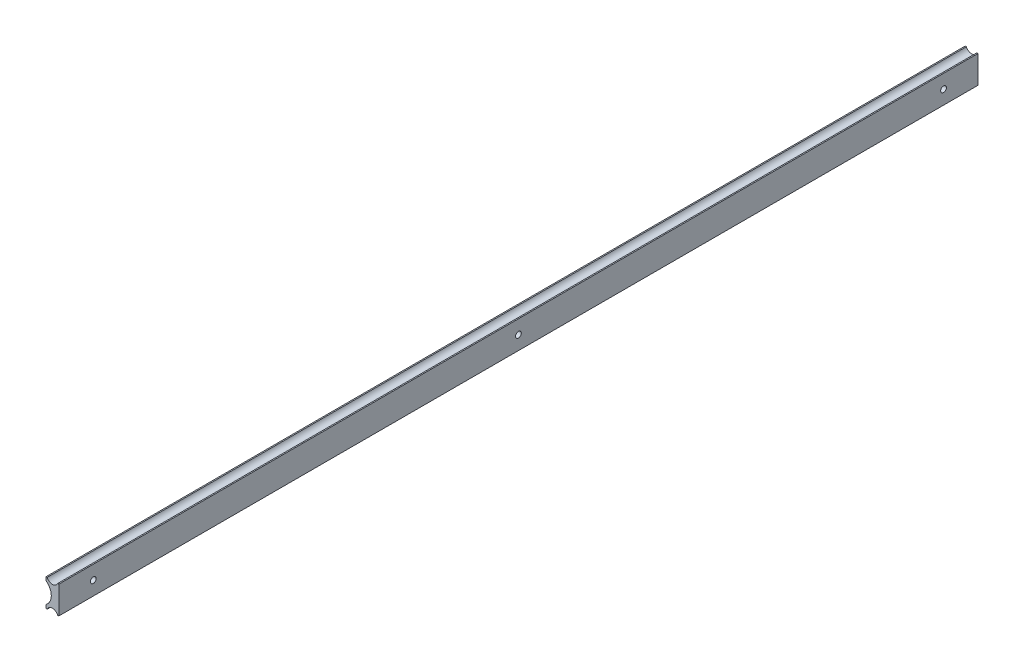
ISO-10303-21;
HEADER;
FILE_DESCRIPTION(('STEP AP214'),'2;1');
FILE_NAME('part.step','',(''),(''),'','','');
FILE_SCHEMA(('AUTOMOTIVE_DESIGN { 1 0 10303 214 1 1 1 1 }'));
ENDSEC;
DATA;
#1=APPLICATION_CONTEXT('core data for automotive mechanical design processes');
#2=APPLICATION_PROTOCOL_DEFINITION('international standard','automotive_design',2000,#1);
#3=PRODUCT_CONTEXT('',#1,'mechanical');
#4=PRODUCT('Part','Part','',(#3));
#5=PRODUCT_RELATED_PRODUCT_CATEGORY('part','',(#4));
#6=PRODUCT_DEFINITION_FORMATION('','',#4);
#7=PRODUCT_DEFINITION_CONTEXT('part definition',#1,'design');
#8=PRODUCT_DEFINITION('design','',#6,#7);
#9=PRODUCT_DEFINITION_SHAPE('','',#8);
#10=(LENGTH_UNIT() NAMED_UNIT(*) SI_UNIT(.MILLI.,.METRE.));
#11=(NAMED_UNIT(*) PLANE_ANGLE_UNIT() SI_UNIT($,.RADIAN.));
#12=(NAMED_UNIT(*) SI_UNIT($,.STERADIAN.) SOLID_ANGLE_UNIT());
#13=UNCERTAINTY_MEASURE_WITH_UNIT(LENGTH_MEASURE(1.E-05),#10,'distance_accuracy_value','');
#14=(GEOMETRIC_REPRESENTATION_CONTEXT(3) GLOBAL_UNCERTAINTY_ASSIGNED_CONTEXT((#13)) GLOBAL_UNIT_ASSIGNED_CONTEXT((#10,
#11,#12)) REPRESENTATION_CONTEXT('',''));
#15=CARTESIAN_POINT('',(0.,0.,0.));
#16=DIRECTION('',(0.,0.,1.));
#17=DIRECTION('',(1.,0.,0.));
#18=AXIS2_PLACEMENT_3D('',#15,#16,#17);
#19=CARTESIAN_POINT('',(-2.8,-6.,200.));
#20=DIRECTION('',(1.,0.,0.));
#21=DIRECTION('',(0.,1.,0.));
#22=AXIS2_PLACEMENT_3D('',#19,#20,#21);
#23=PLANE('',#22);
#24=DIRECTION('',(0.,-1.,0.));
#25=VECTOR('',#24,1.);
#26=CARTESIAN_POINT('',(-2.8,-6.,-200.));
#27=LINE('',#26,#25);
#28=CARTESIAN_POINT('',(-2.8,6.,-200.));
#29=VERTEX_POINT('',#28);
#30=CARTESIAN_POINT('',(-2.8,4.47325384926901,-200.));
#31=VERTEX_POINT('',#30);
#32=EDGE_CURVE('E140',#29,#31,#27,.T.);
#33=ORIENTED_EDGE('',*,*,#32,.T.);
#34=DIRECTION('',(0.,0.,1.));
#35=VECTOR('',#34,1.);
#36=CARTESIAN_POINT('',(-2.8,4.47325384926901,-490.));
#37=LINE('',#36,#35);
#38=CARTESIAN_POINT('',(-2.8,4.47325384926901,200.));
#39=VERTEX_POINT('',#38);
#40=EDGE_CURVE('E60',#31,#39,#37,.T.);
#41=ORIENTED_EDGE('',*,*,#40,.T.);
#42=DIRECTION('',(0.,-1.,0.));
#43=VECTOR('',#42,1.);
#44=CARTESIAN_POINT('',(-2.8,-6.,200.));
#45=LINE('',#44,#43);
#46=CARTESIAN_POINT('',(-2.8,6.,200.));
#47=VERTEX_POINT('',#46);
#48=EDGE_CURVE('E256',#47,#39,#45,.T.);
#49=ORIENTED_EDGE('',*,*,#48,.F.);
#50=DIRECTION('',(0.,0.,-1.));
#51=VECTOR('',#50,1.);
#52=CARTESIAN_POINT('',(-2.8,6.,200.));
#53=LINE('',#52,#51);
#54=EDGE_CURVE('E157',#47,#29,#53,.T.);
#55=ORIENTED_EDGE('',*,*,#54,.T.);
#56=EDGE_LOOP('',(#33,#41,#49,#55));
#57=FACE_BOUND('',#56,.T.);
#58=ADVANCED_FACE('F39',(#57),#23,.F.);
#59=CARTESIAN_POINT('',(-2.8,-6.,200.));
#60=DIRECTION('',(0.,1.,0.));
#61=DIRECTION('',(-1.,0.,0.));
#62=AXIS2_PLACEMENT_3D('',#59,#60,#61);
#63=PLANE('',#62);
#64=DIRECTION('',(0.,0.,1.));
#65=VECTOR('',#64,1.);
#66=CARTESIAN_POINT('',(-2.29128784747792,-6.,-230.));
#67=LINE('',#66,#65);
#68=CARTESIAN_POINT('',(-2.29128784747792,-6.,200.));
#69=VERTEX_POINT('',#68);
#70=CARTESIAN_POINT('',(-2.29128784747792,-6.,-200.));
#71=VERTEX_POINT('',#70);
#72=EDGE_CURVE('E68',#69,#71,#67,.F.);
#73=ORIENTED_EDGE('',*,*,#72,.F.);
#74=DIRECTION('',(1.,0.,0.));
#75=VECTOR('',#74,1.);
#76=CARTESIAN_POINT('',(-2.8,-6.,200.));
#77=LINE('',#76,#75);
#78=CARTESIAN_POINT('',(-2.8,-6.,200.));
#79=VERTEX_POINT('',#78);
#80=EDGE_CURVE('E155',#79,#69,#77,.T.);
#81=ORIENTED_EDGE('',*,*,#80,.F.);
#82=DIRECTION('',(0.,0.,-1.));
#83=VECTOR('',#82,1.);
#84=CARTESIAN_POINT('',(-2.8,-6.,200.));
#85=LINE('',#84,#83);
#86=CARTESIAN_POINT('',(-2.8,-6.,-200.));
#87=VERTEX_POINT('',#86);
#88=EDGE_CURVE('E154',#79,#87,#85,.T.);
#89=ORIENTED_EDGE('',*,*,#88,.T.);
#90=DIRECTION('',(1.,0.,0.));
#91=VECTOR('',#90,1.);
#92=CARTESIAN_POINT('',(-2.8,-6.,-200.));
#93=LINE('',#92,#91);
#94=EDGE_CURVE('E139',#87,#71,#93,.T.);
#95=ORIENTED_EDGE('',*,*,#94,.T.);
#96=EDGE_LOOP('',(#73,#81,#89,#95));
#97=FACE_BOUND('',#96,.T.);
#98=ADVANCED_FACE('F196',(#97),#63,.F.);
#99=DIRECTION('',(0.,0.,1.));
#100=VECTOR('',#99,1.);
#101=CARTESIAN_POINT('',(2.29128784747792,-6.,-230.));
#102=LINE('',#101,#100);
#103=CARTESIAN_POINT('',(2.29128784747792,-6.,-200.));
#104=VERTEX_POINT('',#103);
#105=CARTESIAN_POINT('',(2.29128784747792,-6.,200.));
#106=VERTEX_POINT('',#105);
#107=EDGE_CURVE('E266',#104,#106,#102,.T.);
#108=ORIENTED_EDGE('',*,*,#107,.F.);
#109=CARTESIAN_POINT('',(2.8,-6.,-200.));
#110=VERTEX_POINT('',#109);
#111=EDGE_CURVE('E143',#104,#110,#93,.T.);
#112=ORIENTED_EDGE('',*,*,#111,.T.);
#113=DIRECTION('',(0.,0.,-1.));
#114=VECTOR('',#113,1.);
#115=CARTESIAN_POINT('',(2.8,-6.,200.));
#116=LINE('',#115,#114);
#117=CARTESIAN_POINT('',(2.8,-6.,200.));
#118=VERTEX_POINT('',#117);
#119=EDGE_CURVE('E151',#118,#110,#116,.T.);
#120=ORIENTED_EDGE('',*,*,#119,.F.);
#121=EDGE_CURVE('E259',#106,#118,#77,.T.);
#122=ORIENTED_EDGE('',*,*,#121,.F.);
#123=EDGE_LOOP('',(#108,#112,#120,#122));
#124=FACE_BOUND('',#123,.T.);
#125=ADVANCED_FACE('F202',(#124),#63,.F.);
#126=CARTESIAN_POINT('',(-2.8,6.,200.));
#127=DIRECTION('',(0.,-1.,0.));
#128=DIRECTION('',(1.,0.,0.));
#129=AXIS2_PLACEMENT_3D('',#126,#127,#128);
#130=PLANE('',#129);
#131=DIRECTION('',(-1.,0.,0.));
#132=VECTOR('',#131,1.);
#133=CARTESIAN_POINT('',(-2.8,6.,-200.));
#134=LINE('',#133,#132);
#135=CARTESIAN_POINT('',(2.8,6.,-200.));
#136=VERTEX_POINT('',#135);
#137=CARTESIAN_POINT('',(2.29128784747792,6.,-200.));
#138=VERTEX_POINT('',#137);
#139=EDGE_CURVE('E141',#136,#138,#134,.T.);
#140=ORIENTED_EDGE('',*,*,#139,.T.);
#141=DIRECTION('',(0.,0.,1.));
#142=VECTOR('',#141,1.);
#143=CARTESIAN_POINT('',(2.29128784747792,6.,-230.));
#144=LINE('',#143,#142);
#145=CARTESIAN_POINT('',(2.29128784747792,6.,200.));
#146=VERTEX_POINT('',#145);
#147=EDGE_CURVE('E228',#138,#146,#144,.T.);
#148=ORIENTED_EDGE('',*,*,#147,.T.);
#149=DIRECTION('',(-1.,0.,0.));
#150=VECTOR('',#149,1.);
#151=CARTESIAN_POINT('',(-2.8,6.,200.));
#152=LINE('',#151,#150);
#153=CARTESIAN_POINT('',(2.8,6.,200.));
#154=VERTEX_POINT('',#153);
#155=EDGE_CURVE('E254',#154,#146,#152,.T.);
#156=ORIENTED_EDGE('',*,*,#155,.F.);
#157=DIRECTION('',(0.,0.,-1.));
#158=VECTOR('',#157,1.);
#159=CARTESIAN_POINT('',(2.8,6.,200.));
#160=LINE('',#159,#158);
#161=EDGE_CURVE('E160',#154,#136,#160,.T.);
#162=ORIENTED_EDGE('',*,*,#161,.T.);
#163=EDGE_LOOP('',(#140,#148,#156,#162));
#164=FACE_BOUND('',#163,.T.);
#165=ADVANCED_FACE('F215',(#164),#130,.F.);
#166=CARTESIAN_POINT('',(2.8,-6.,200.));
#167=DIRECTION('',(-1.,0.,0.));
#168=DIRECTION('',(0.,0.,1.));
#169=AXIS2_PLACEMENT_3D('',#166,#167,#168);
#170=PLANE('',#169);
#171=CARTESIAN_POINT('',(2.8,0.,185.));
#172=DIRECTION('',(1.,0.,0.));
#173=DIRECTION('',(0.,0.,-1.));
#174=AXIS2_PLACEMENT_3D('',#171,#172,#173);
#175=CIRCLE('',#174,1.25);
#176=CARTESIAN_POINT('',(2.8,0.,183.75));
#177=VERTEX_POINT('',#176);
#178=EDGE_CURVE('E280',#177,#177,#175,.T.);
#179=ORIENTED_EDGE('',*,*,#178,.F.);
#180=EDGE_LOOP('',(#179));
#181=FACE_BOUND('',#180,.T.);
#182=CARTESIAN_POINT('',(2.8,0.,0.));
#183=DIRECTION('',(1.,0.,0.));
#184=DIRECTION('',(0.,0.,-1.));
#185=AXIS2_PLACEMENT_3D('',#182,#183,#184);
#186=CIRCLE('',#185,1.25);
#187=CARTESIAN_POINT('',(2.8,0.,-1.25));
#188=VERTEX_POINT('',#187);
#189=EDGE_CURVE('E277',#188,#188,#186,.T.);
#190=ORIENTED_EDGE('',*,*,#189,.F.);
#191=EDGE_LOOP('',(#190));
#192=FACE_BOUND('',#191,.T.);
#193=CARTESIAN_POINT('',(2.8,0.,-185.));
#194=DIRECTION('',(1.,0.,0.));
#195=DIRECTION('',(0.,0.,-1.));
#196=AXIS2_PLACEMENT_3D('',#193,#194,#195);
#197=CIRCLE('',#196,1.25);
#198=CARTESIAN_POINT('',(2.8,0.,-186.25));
#199=VERTEX_POINT('',#198);
#200=EDGE_CURVE('E171',#199,#199,#197,.T.);
#201=ORIENTED_EDGE('',*,*,#200,.F.);
#202=EDGE_LOOP('',(#201));
#203=FACE_BOUND('',#202,.T.);
#204=DIRECTION('',(0.,1.,0.));
#205=VECTOR('',#204,1.);
#206=CARTESIAN_POINT('',(2.8,-6.,-200.));
#207=LINE('',#206,#205);
#208=EDGE_CURVE('E235',#110,#136,#207,.T.);
#209=ORIENTED_EDGE('',*,*,#208,.T.);
#210=ORIENTED_EDGE('',*,*,#161,.F.);
#211=DIRECTION('',(0.,1.,0.));
#212=VECTOR('',#211,1.);
#213=CARTESIAN_POINT('',(2.8,-6.,200.));
#214=LINE('',#213,#212);
#215=EDGE_CURVE('E150',#118,#154,#214,.T.);
#216=ORIENTED_EDGE('',*,*,#215,.F.);
#217=ORIENTED_EDGE('',*,*,#119,.T.);
#218=EDGE_LOOP('',(#209,#210,#216,#217));
#219=FACE_BOUND('',#218,.T.);
#220=ADVANCED_FACE('F41',(#181,#192,#203,#219),#170,.F.);
#221=CARTESIAN_POINT('',(-2.29128784747792,6.,200.));
#222=VERTEX_POINT('',#221);
#223=EDGE_CURVE('E243',#222,#47,#152,.T.);
#224=ORIENTED_EDGE('',*,*,#223,.F.);
#225=DIRECTION('',(0.,0.,1.));
#226=VECTOR('',#225,1.);
#227=CARTESIAN_POINT('',(-2.29128784747792,6.,-230.));
#228=LINE('',#227,#226);
#229=CARTESIAN_POINT('',(-2.29128784747792,6.,-200.));
#230=VERTEX_POINT('',#229);
#231=EDGE_CURVE('E240',#222,#230,#228,.F.);
#232=ORIENTED_EDGE('',*,*,#231,.T.);
#233=EDGE_CURVE('E145',#230,#29,#134,.T.);
#234=ORIENTED_EDGE('',*,*,#233,.T.);
#235=ORIENTED_EDGE('',*,*,#54,.F.);
#236=EDGE_LOOP('',(#224,#232,#234,#235));
#237=FACE_BOUND('',#236,.T.);
#238=ADVANCED_FACE('F207',(#237),#130,.F.);
#239=CARTESIAN_POINT('',(-2.8,-4.47325384926901,200.));
#240=VERTEX_POINT('',#239);
#241=EDGE_CURVE('E133',#240,#79,#45,.T.);
#242=ORIENTED_EDGE('',*,*,#241,.F.);
#243=DIRECTION('',(0.,0.,1.));
#244=VECTOR('',#243,1.);
#245=CARTESIAN_POINT('',(-2.8,-4.47325384926901,-490.));
#246=LINE('',#245,#244);
#247=CARTESIAN_POINT('',(-2.8,-4.47325384926901,-200.));
#248=VERTEX_POINT('',#247);
#249=EDGE_CURVE('E121',#240,#248,#246,.F.);
#250=ORIENTED_EDGE('',*,*,#249,.T.);
#251=EDGE_CURVE('E131',#248,#87,#27,.T.);
#252=ORIENTED_EDGE('',*,*,#251,.T.);
#253=ORIENTED_EDGE('',*,*,#88,.F.);
#254=EDGE_LOOP('',(#242,#250,#252,#253));
#255=FACE_BOUND('',#254,.T.);
#256=ADVANCED_FACE('F129',(#255),#23,.F.);
#257=CARTESIAN_POINT('',(0.,0.,200.));
#258=DIRECTION('',(0.,0.,-1.));
#259=DIRECTION('',(-1.,0.,0.));
#260=AXIS2_PLACEMENT_3D('',#257,#258,#259);
#261=PLANE('',#260);
#262=ORIENTED_EDGE('',*,*,#48,.T.);
#263=CARTESIAN_POINT('',(-6.,0.,200.));
#264=DIRECTION('',(0.,0.,-1.));
#265=DIRECTION('',(-1.,0.,0.));
#266=AXIS2_PLACEMENT_3D('',#263,#264,#265);
#267=CIRCLE('',#266,5.5);
#268=EDGE_CURVE('E269',#39,#240,#267,.T.);
#269=ORIENTED_EDGE('',*,*,#268,.T.);
#270=ORIENTED_EDGE('',*,*,#241,.T.);
#271=ORIENTED_EDGE('',*,*,#80,.T.);
#272=CARTESIAN_POINT('',(0.,-7.,200.));
#273=DIRECTION('',(0.,0.,-1.));
#274=DIRECTION('',(-1.,0.,0.));
#275=AXIS2_PLACEMENT_3D('',#272,#273,#274);
#276=CIRCLE('',#275,2.5);
#277=EDGE_CURVE('E244',#106,#69,#276,.F.);
#278=ORIENTED_EDGE('',*,*,#277,.F.);
#279=ORIENTED_EDGE('',*,*,#121,.T.);
#280=ORIENTED_EDGE('',*,*,#215,.T.);
#281=ORIENTED_EDGE('',*,*,#155,.T.);
#282=CARTESIAN_POINT('',(0.,7.,200.));
#283=DIRECTION('',(0.,0.,-1.));
#284=DIRECTION('',(-1.,0.,0.));
#285=AXIS2_PLACEMENT_3D('',#282,#283,#284);
#286=CIRCLE('',#285,2.5);
#287=EDGE_CURVE('E246',#146,#222,#286,.T.);
#288=ORIENTED_EDGE('',*,*,#287,.T.);
#289=ORIENTED_EDGE('',*,*,#223,.T.);
#290=EDGE_LOOP('',(#262,#269,#270,#271,#278,#279,#280,#281,#288,#289));
#291=FACE_BOUND('',#290,.T.);
#292=ADVANCED_FACE('F206',(#291),#261,.F.);
#293=CARTESIAN_POINT('',(0.,0.,-200.));
#294=DIRECTION('',(0.,0.,-1.));
#295=DIRECTION('',(-1.,0.,0.));
#296=AXIS2_PLACEMENT_3D('',#293,#294,#295);
#297=PLANE('',#296);
#298=CARTESIAN_POINT('',(-6.,0.,-200.));
#299=DIRECTION('',(0.,0.,-1.));
#300=DIRECTION('',(-1.,0.,0.));
#301=AXIS2_PLACEMENT_3D('',#298,#299,#300);
#302=CIRCLE('',#301,5.5);
#303=EDGE_CURVE('E11',#31,#248,#302,.T.);
#304=ORIENTED_EDGE('',*,*,#303,.F.);
#305=ORIENTED_EDGE('',*,*,#32,.F.);
#306=ORIENTED_EDGE('',*,*,#233,.F.);
#307=CARTESIAN_POINT('',(0.,7.,-200.));
#308=DIRECTION('',(0.,0.,-1.));
#309=DIRECTION('',(-1.,0.,0.));
#310=AXIS2_PLACEMENT_3D('',#307,#308,#309);
#311=CIRCLE('',#310,2.5);
#312=EDGE_CURVE('E163',#138,#230,#311,.T.);
#313=ORIENTED_EDGE('',*,*,#312,.F.);
#314=ORIENTED_EDGE('',*,*,#139,.F.);
#315=ORIENTED_EDGE('',*,*,#208,.F.);
#316=ORIENTED_EDGE('',*,*,#111,.F.);
#317=CARTESIAN_POINT('',(0.,-7.,-200.));
#318=DIRECTION('',(0.,0.,-1.));
#319=DIRECTION('',(-1.,0.,0.));
#320=AXIS2_PLACEMENT_3D('',#317,#318,#319);
#321=CIRCLE('',#320,2.5);
#322=EDGE_CURVE('E53',#104,#71,#321,.F.);
#323=ORIENTED_EDGE('',*,*,#322,.T.);
#324=ORIENTED_EDGE('',*,*,#94,.F.);
#325=ORIENTED_EDGE('',*,*,#251,.F.);
#326=EDGE_LOOP('',(#304,#305,#306,#313,#314,#315,#316,#323,#324,#325));
#327=FACE_BOUND('',#326,.T.);
#328=ADVANCED_FACE('F137',(#327),#297,.T.);
#329=CARTESIAN_POINT('',(0.,7.,-230.));
#330=DIRECTION('',(0.,0.,1.));
#331=DIRECTION('',(1.,0.,0.));
#332=AXIS2_PLACEMENT_3D('',#329,#330,#331);
#333=CYLINDRICAL_SURFACE('',#332,2.5);
#334=ORIENTED_EDGE('',*,*,#147,.F.);
#335=ORIENTED_EDGE('',*,*,#312,.T.);
#336=ORIENTED_EDGE('',*,*,#231,.F.);
#337=ORIENTED_EDGE('',*,*,#287,.F.);
#338=EDGE_LOOP('',(#334,#335,#336,#337));
#339=FACE_BOUND('',#338,.T.);
#340=ADVANCED_FACE('F239',(#339),#333,.F.);
#341=CARTESIAN_POINT('',(0.,-7.,-230.));
#342=DIRECTION('',(0.,0.,1.));
#343=DIRECTION('',(1.,0.,0.));
#344=AXIS2_PLACEMENT_3D('',#341,#342,#343);
#345=CYLINDRICAL_SURFACE('',#344,2.5);
#346=ORIENTED_EDGE('',*,*,#277,.T.);
#347=ORIENTED_EDGE('',*,*,#72,.T.);
#348=ORIENTED_EDGE('',*,*,#322,.F.);
#349=ORIENTED_EDGE('',*,*,#107,.T.);
#350=EDGE_LOOP('',(#346,#347,#348,#349));
#351=FACE_BOUND('',#350,.T.);
#352=ADVANCED_FACE('F287',(#351),#345,.F.);
#353=CARTESIAN_POINT('',(-6.,0.,-490.));
#354=DIRECTION('',(0.,0.,1.));
#355=DIRECTION('',(1.,0.,0.));
#356=AXIS2_PLACEMENT_3D('',#353,#354,#355);
#357=CYLINDRICAL_SURFACE('',#356,5.5);
#358=CARTESIAN_POINT('',(-0.5,0.,183.75));
#359=CARTESIAN_POINT('',(-0.500001263240743,0.0692591392984521,183.750002265913));
#360=CARTESIAN_POINT('',(-0.501321453269348,0.138545086129005,183.755775613788));
#361=CARTESIAN_POINT('',(-0.506460339847005,0.275144297299661,183.778689738031));
#362=CARTESIAN_POINT('',(-0.51028072518676,0.342456196110362,183.795838197978));
#363=CARTESIAN_POINT('',(-0.519995234385313,0.473113835992452,183.840934024316));
#364=CARTESIAN_POINT('',(-0.525887105716305,0.53646379747823,183.86886966399));
#365=CARTESIAN_POINT('',(-0.539110899186493,0.657576137912824,183.93470855669));
#366=CARTESIAN_POINT('',(-0.546442806980076,0.715338572515906,183.972611710421));
#367=CARTESIAN_POINT('',(-0.561886709159301,0.824633802223188,184.058001022303));
#368=CARTESIAN_POINT('',(-0.570009012083716,0.876056469460246,184.105626286738));
#369=CARTESIAN_POINT('',(-0.586046744083479,0.970256949083057,184.208809487069));
#370=CARTESIAN_POINT('',(-0.593962153453349,1.01303394060893,184.264368175347));
#371=CARTESIAN_POINT('',(-0.60879208153895,1.08922299700894,184.382666027642));
#372=CARTESIAN_POINT('',(-0.615693420971134,1.12251627178288,184.445483498153));
#373=CARTESIAN_POINT('',(-0.627565192624573,1.17803034858935,184.576004750291));
#374=CARTESIAN_POINT('',(-0.632535875591614,1.20025258858875,184.643707896031));
#375=CARTESIAN_POINT('',(-0.639878276508472,1.23262674706359,184.780879593558));
#376=CARTESIAN_POINT('',(-0.642292101330496,1.24297446340376,184.850299631561));
#377=CARTESIAN_POINT('',(-0.644373829661611,1.25191494225743,184.989929113607));
#378=CARTESIAN_POINT('',(-0.644042098670987,1.25050926943276,185.060138451331));
#379=CARTESIAN_POINT('',(-0.640708248204032,1.23614008479381,185.197886441674));
#380=CARTESIAN_POINT('',(-0.63775902935122,1.22340552299719,185.265450453097));
#381=CARTESIAN_POINT('',(-0.629606316362841,1.18710342460251,185.397457243077));
#382=CARTESIAN_POINT('',(-0.624402686762803,1.16353523702143,185.461899833814));
#383=CARTESIAN_POINT('',(-0.612276280773162,1.10602867201271,185.586470335905));
#384=CARTESIAN_POINT('',(-0.60533922010875,1.07200356043003,185.646556758882));
#385=CARTESIAN_POINT('',(-0.590536157837931,0.994609889602041,185.760251276556));
#386=CARTESIAN_POINT('',(-0.582670020182688,0.951239961185675,185.813858420132));
#387=CARTESIAN_POINT('',(-0.566669235637469,0.855182590017586,185.914389280911));
#388=CARTESIAN_POINT('',(-0.55853261324251,0.802300833714137,185.961127213258));
#389=CARTESIAN_POINT('',(-0.543074870142089,0.689356149204858,186.045102944354));
#390=CARTESIAN_POINT('',(-0.535753766585336,0.629293070045398,186.08234054335));
#391=CARTESIAN_POINT('',(-0.522725128768129,0.503453995899576,186.146310193986));
#392=CARTESIAN_POINT('',(-0.517021575756328,0.437664417174079,186.173016386811));
#393=CARTESIAN_POINT('',(-0.507900052165088,0.302372561245851,186.214942002934));
#394=CARTESIAN_POINT('',(-0.504481722110805,0.232870869831863,186.230163232911));
#395=CARTESIAN_POINT('',(-0.500367496412198,0.0937199200963689,186.248413118736));
#396=CARTESIAN_POINT('',(-0.499614990794364,0.0241055461685207,186.251695345658));
#397=CARTESIAN_POINT('',(-0.500757887246839,-0.114676943340051,186.246663480074));
#398=CARTESIAN_POINT('',(-0.502653094604417,-0.183845091360428,186.238350240297));
#399=CARTESIAN_POINT('',(-0.508842594812925,-0.318920838609226,186.210573416547));
#400=CARTESIAN_POINT('',(-0.513107956472499,-0.384857518407208,186.191244226778));
#401=CARTESIAN_POINT('',(-0.52355969338164,-0.5125519654388,186.142134486271));
#402=CARTESIAN_POINT('',(-0.529746240972279,-0.574309357161445,186.112352997873));
#403=CARTESIAN_POINT('',(-0.543492836245261,-0.692930426280284,186.042665428222));
#404=CARTESIAN_POINT('',(-0.551072350723401,-0.749705342613602,186.002612186613));
#405=CARTESIAN_POINT('',(-0.566726952177014,-0.855818867895262,185.91371033578));
#406=CARTESIAN_POINT('',(-0.57480210890438,-0.905156426789845,185.864860486727));
#407=CARTESIAN_POINT('',(-0.590735614275665,-0.996008531090477,185.758584517433));
#408=CARTESIAN_POINT('',(-0.598586394037334,-1.03734683297031,185.701006379107));
#409=CARTESIAN_POINT('',(-0.612998833919801,-1.10976907203277,185.579576804665));
#410=CARTESIAN_POINT('',(-0.619560551020381,-1.14085346250509,185.51572564602));
#411=CARTESIAN_POINT('',(-0.630586256466319,-1.19166798620963,185.383909765216));
#412=CARTESIAN_POINT('',(-0.635062310914904,-1.21146358110852,185.315971338128));
#413=CARTESIAN_POINT('',(-0.641429447070934,-1.23932629170182,185.17761654665));
#414=CARTESIAN_POINT('',(-0.643320980446034,-1.24739545670807,185.107200617432));
#415=CARTESIAN_POINT('',(-0.644274852838879,-1.25148369607082,184.967670690345));
#416=CARTESIAN_POINT('',(-0.643402927091149,-1.24778274250535,184.898565200333));
#417=CARTESIAN_POINT('',(-0.639077657654307,-1.22906557701642,184.761990544906));
#418=CARTESIAN_POINT('',(-0.635624349552616,-1.21404952108504,184.694521356945));
#419=CARTESIAN_POINT('',(-0.626558698647584,-1.17326846180304,184.563378301317));
#420=CARTESIAN_POINT('',(-0.62095516656649,-1.14754728763997,184.499690154429));
#421=CARTESIAN_POINT('',(-0.608217638359476,-1.08612268303439,184.37749264655));
#422=CARTESIAN_POINT('',(-0.601083468401715,-1.05041811865611,184.318983874837));
#423=CARTESIAN_POINT('',(-0.58589446368298,-0.969124984455247,184.207432786172));
#424=CARTESIAN_POINT('',(-0.577822972060685,-0.923338228214174,184.154537138896));
#425=CARTESIAN_POINT('',(-0.561777257034756,-0.82357814466209,184.057088407459));
#426=CARTESIAN_POINT('',(-0.553803056666771,-0.769602917703377,184.012537264517));
#427=CARTESIAN_POINT('',(-0.53871533054793,-0.65407030257528,183.932430969883));
#428=CARTESIAN_POINT('',(-0.53161569191443,-0.592415810938098,183.897013088333));
#429=CARTESIAN_POINT('',(-0.519217972430033,-0.463877983855847,183.837100014669));
#430=CARTESIAN_POINT('',(-0.513918437666384,-0.396998922168851,183.812596002607));
#431=CARTESIAN_POINT('',(-0.506622024360816,-0.275081535769814,183.779386046912));
#432=CARTESIAN_POINT('',(-0.504154572075069,-0.220684055569247,183.768388006155));
#433=CARTESIAN_POINT('',(-0.500843095963122,-0.110863407465459,183.75369426321));
#434=CARTESIAN_POINT('',(-0.499998988805856,-0.0554402923585515,183.74999818619));
#435=CARTESIAN_POINT('',(-0.5,0.,183.75));
#436=B_SPLINE_CURVE_WITH_KNOTS('',3,(#358,#359,#360,#361,#362,#363,#364,#365,#366,#367,#368,
#369,#370,#371,#372,#373,#374,#375,#376,#377,#378,#379,#380,#381,#382,#383,#384,#385,#386,#387,
#388,#389,#390,#391,#392,#393,#394,#395,#396,#397,#398,#399,#400,#401,#402,#403,#404,#405,#406,
#407,#408,#409,#410,#411,#412,#413,#414,#415,#416,#417,#418,#419,#420,#421,#422,#423,#424,#425,
#426,#427,#428,#429,#430,#431,#432,#433,#434,#435),.UNSPECIFIED.,.T.,.F.,(4,2,2,2,2,2,2,2,2,2,2,
2,2,2,2,2,2,2,2,2,2,2,2,2,2,2,2,2,2,2,2,2,2,2,2,2,2,2,4),(0.,0.207574424816656,
0.415289203498468,0.622778808776575,0.830266347152622,1.04096194698405,1.25167754182902,
1.46492681486708,1.67814838269119,1.88780122449037,2.0974261568438,2.30290857087118,
2.50840333376987,2.71565078719426,2.92292862648989,3.13505765901853,3.34719115134933,
3.55984232048324,3.77246003084948,3.98053470958381,4.18859408731814,4.39416788074518,
4.59976012061543,4.80848064664384,5.01723061362838,5.23015660770199,5.44307318779741,
5.65474220954494,5.86637423554698,6.07301021975724,6.2796433552977,6.48543868288076,
6.69125739465901,6.90155512892953,7.11190172510033,7.32524638726732,7.53841832261077,
7.70458523862179,7.87074362457001),.UNSPECIFIED.);
#437=CARTESIAN_POINT('',(-0.5,0.,183.75));
#438=VERTEX_POINT('',#437);
#439=EDGE_CURVE('E43',#438,#438,#436,.T.);
#440=ORIENTED_EDGE('',*,*,#439,.T.);
#441=EDGE_LOOP('',(#440));
#442=FACE_BOUND('',#441,.T.);
#443=CARTESIAN_POINT('',(-0.5,0.,-1.25));
#444=CARTESIAN_POINT('',(-0.500001263240743,0.0692591392984521,-1.24999773408679));
#445=CARTESIAN_POINT('',(-0.501321453269348,0.138545086129004,-1.24422438621155));
#446=CARTESIAN_POINT('',(-0.506460339847006,0.275144297299661,-1.22131026196915));
#447=CARTESIAN_POINT('',(-0.510280725186761,0.342456196110364,-1.20416180202237));
#448=CARTESIAN_POINT('',(-0.519995234385313,0.473113835992457,-1.15906597568405));
#449=CARTESIAN_POINT('',(-0.525887105716305,0.536463797478235,-1.13113033600963));
#450=CARTESIAN_POINT('',(-0.539110899186493,0.657576137912829,-1.06529144330956));
#451=CARTESIAN_POINT('',(-0.546442806980077,0.715338572515909,-1.02738828957879));
#452=CARTESIAN_POINT('',(-0.561886709159301,0.824633802223188,-0.941998977696662));
#453=CARTESIAN_POINT('',(-0.570009012083715,0.876056469460244,-0.894373713262496));
#454=CARTESIAN_POINT('',(-0.586046744083478,0.970256949083051,-0.791190512931376));
#455=CARTESIAN_POINT('',(-0.593962153453347,1.01303394060892,-0.735631824652773));
#456=CARTESIAN_POINT('',(-0.608792081538949,1.08922299700893,-0.617333972358157));
#457=CARTESIAN_POINT('',(-0.615693420971133,1.12251627178287,-0.554516501847083));
#458=CARTESIAN_POINT('',(-0.627565192624573,1.17803034858935,-0.423995249709188));
#459=CARTESIAN_POINT('',(-0.632535875591613,1.20025258858874,-0.35629210396919));
#460=CARTESIAN_POINT('',(-0.639878276508472,1.23262674706359,-0.219120406441732));
#461=CARTESIAN_POINT('',(-0.642292101330497,1.24297446340377,-0.149700368438727));
#462=CARTESIAN_POINT('',(-0.644373829661611,1.25191494225743,-0.010070886393447));
#463=CARTESIAN_POINT('',(-0.644042098670987,1.25050926943276,0.0601384513311372));
#464=CARTESIAN_POINT('',(-0.640708248204032,1.23614008479381,0.197886441674348));
#465=CARTESIAN_POINT('',(-0.637759029351218,1.22340552299719,0.265450453097454));
#466=CARTESIAN_POINT('',(-0.629606316362841,1.18710342460251,0.39745724307741));
#467=CARTESIAN_POINT('',(-0.624402686762804,1.16353523702144,0.461899833813591));
#468=CARTESIAN_POINT('',(-0.612276280773165,1.10602867201272,0.586470335905266));
#469=CARTESIAN_POINT('',(-0.605339220108751,1.07200356043004,0.646556758881844));
#470=CARTESIAN_POINT('',(-0.590536157837931,0.994609889602038,0.760251276555532));
#471=CARTESIAN_POINT('',(-0.582670020182689,0.95123996118567,0.813858420131967));
#472=CARTESIAN_POINT('',(-0.566669235637469,0.855182590017582,0.91438928091051));
#473=CARTESIAN_POINT('',(-0.558532613242511,0.802300833714137,0.961127213258176));
#474=CARTESIAN_POINT('',(-0.54307487014209,0.689356149204861,1.04510294435355));
#475=CARTESIAN_POINT('',(-0.535753766585336,0.6292930700454,1.08234054334974));
#476=CARTESIAN_POINT('',(-0.522725128768129,0.503453995899577,1.14631019398575));
#477=CARTESIAN_POINT('',(-0.517021575756329,0.437664417174079,1.17301638681116));
#478=CARTESIAN_POINT('',(-0.507900052165088,0.302372561245849,1.21494200293396));
#479=CARTESIAN_POINT('',(-0.504481722110804,0.232870869831861,1.23016323291109));
#480=CARTESIAN_POINT('',(-0.500367496412197,0.093719920096367,1.24841311873634));
#481=CARTESIAN_POINT('',(-0.499614990794364,0.0241055461685199,1.25169534565837));
#482=CARTESIAN_POINT('',(-0.500757887246839,-0.114676943340051,1.24666348007353));
#483=CARTESIAN_POINT('',(-0.502653094604418,-0.183845091360428,1.23835024029701));
#484=CARTESIAN_POINT('',(-0.508842594812926,-0.318920838609228,1.21057341654729));
#485=CARTESIAN_POINT('',(-0.5131079564725,-0.384857518407212,1.19124422677813));
#486=CARTESIAN_POINT('',(-0.52355969338164,-0.512551965438801,1.14213448627146));
#487=CARTESIAN_POINT('',(-0.529746240972279,-0.574309357161443,1.11235299787337));
#488=CARTESIAN_POINT('',(-0.54349283624526,-0.692930426280278,1.04266542822233));
#489=CARTESIAN_POINT('',(-0.551072350723401,-0.749705342613596,1.00261218661342));
#490=CARTESIAN_POINT('',(-0.566726952177014,-0.855818867895259,0.913710335779897));
#491=CARTESIAN_POINT('',(-0.574802108904381,-0.905156426789847,0.864860486726578));
#492=CARTESIAN_POINT('',(-0.590735614275666,-0.996008531090477,0.758584517433289));
#493=CARTESIAN_POINT('',(-0.598586394037332,-1.03734683297031,0.701006379106595));
#494=CARTESIAN_POINT('',(-0.612998833919799,-1.10976907203276,0.579576804664862));
#495=CARTESIAN_POINT('',(-0.61956055102038,-1.14085346250508,0.515725646020189));
#496=CARTESIAN_POINT('',(-0.630586256466319,-1.19166798620964,0.383909765215544));
#497=CARTESIAN_POINT('',(-0.635062310914904,-1.21146358110852,0.315971338128326));
#498=CARTESIAN_POINT('',(-0.641429447070934,-1.23932629170182,0.177616546650439));
#499=CARTESIAN_POINT('',(-0.643320980446034,-1.24739545670807,0.107200617431803));
#500=CARTESIAN_POINT('',(-0.644274852838879,-1.25148369607082,-0.0323293096554462));
#501=CARTESIAN_POINT('',(-0.643402927091148,-1.24778274250535,-0.101434799666798));
#502=CARTESIAN_POINT('',(-0.639077657654306,-1.22906557701641,-0.238009455094128));
#503=CARTESIAN_POINT('',(-0.635624349552616,-1.21404952108504,-0.305478643055235));
#504=CARTESIAN_POINT('',(-0.626558698647585,-1.17326846180304,-0.43662169868314));
#505=CARTESIAN_POINT('',(-0.620955166566491,-1.14754728763997,-0.500309845570748));
#506=CARTESIAN_POINT('',(-0.608217638359477,-1.0861226830344,-0.622507353450302));
#507=CARTESIAN_POINT('',(-0.601083468401716,-1.05041811865611,-0.681016125162753));
#508=CARTESIAN_POINT('',(-0.585894463682979,-0.969124984455245,-0.792567213827635));
#509=CARTESIAN_POINT('',(-0.577822972060683,-0.92333822821417,-0.845462861103688));
#510=CARTESIAN_POINT('',(-0.561777257034755,-0.823578144662086,-0.942911592540975));
#511=CARTESIAN_POINT('',(-0.55380305666677,-0.769602917703377,-0.987462735482983));
#512=CARTESIAN_POINT('',(-0.53871533054793,-0.654070302575282,-1.06756903011686));
#513=CARTESIAN_POINT('',(-0.53161569191443,-0.592415810938098,-1.10298691166657));
#514=CARTESIAN_POINT('',(-0.519217972430033,-0.463877983855844,-1.16289998533148));
#515=CARTESIAN_POINT('',(-0.513918437666383,-0.396998922168847,-1.18740399739334));
#516=CARTESIAN_POINT('',(-0.506622024360815,-0.27508153576981,-1.22061395308806));
#517=CARTESIAN_POINT('',(-0.504154572075068,-0.220684055569244,-1.23161199384465));
#518=CARTESIAN_POINT('',(-0.500843095963122,-0.110863407465458,-1.24630573678967));
#519=CARTESIAN_POINT('',(-0.499998988805856,-0.0554402923585502,-1.25000181380958));
#520=CARTESIAN_POINT('',(-0.5,0.,-1.25));
#521=B_SPLINE_CURVE_WITH_KNOTS('',3,(#443,#444,#445,#446,#447,#448,#449,#450,#451,#452,#453,
#454,#455,#456,#457,#458,#459,#460,#461,#462,#463,#464,#465,#466,#467,#468,#469,#470,#471,#472,
#473,#474,#475,#476,#477,#478,#479,#480,#481,#482,#483,#484,#485,#486,#487,#488,#489,#490,#491,
#492,#493,#494,#495,#496,#497,#498,#499,#500,#501,#502,#503,#504,#505,#506,#507,#508,#509,#510,
#511,#512,#513,#514,#515,#516,#517,#518,#519,#520),.UNSPECIFIED.,.T.,.F.,(4,2,2,2,2,2,2,2,2,2,2,
2,2,2,2,2,2,2,2,2,2,2,2,2,2,2,2,2,2,2,2,2,2,2,2,2,2,2,4),(0.,0.207574424816657,
0.415289203498464,0.622778808776591,0.830266347152623,1.04096194698404,1.25167754182901,
1.46492681486707,1.67814838269119,1.88780122449041,2.09742615684378,2.30290857087117,
2.50840333376985,2.71565078719425,2.92292862648989,3.13505765901851,3.34719115134931,
3.55984232048323,3.77246003084947,3.9805347095838,4.18859408731813,4.39416788074517,
4.59976012061541,4.80848064664383,5.01723061362836,5.23015660770197,5.44307318779738,
5.65474220954494,5.86637423554698,6.07301021975726,6.27964335529767,6.48543868288072,
6.691257394659,6.90155512892953,7.11190172510033,7.32524638726732,7.53841832261076,
7.70458523862178,7.87074362457),.UNSPECIFIED.);
#522=CARTESIAN_POINT('',(-0.5,0.,-1.25));
#523=VERTEX_POINT('',#522);
#524=EDGE_CURVE('E172',#523,#523,#521,.T.);
#525=ORIENTED_EDGE('',*,*,#524,.T.);
#526=EDGE_LOOP('',(#525));
#527=FACE_BOUND('',#526,.T.);
#528=CARTESIAN_POINT('',(-0.5,0.,-186.25));
#529=CARTESIAN_POINT('',(-0.500001263240744,0.06925913929852,-186.249997734087));
#530=CARTESIAN_POINT('',(-0.50132145326935,0.138545086129073,-186.244224386212));
#531=CARTESIAN_POINT('',(-0.506460339847009,0.27514429729973,-186.221310261969));
#532=CARTESIAN_POINT('',(-0.510280725186765,0.342456196110433,-186.204161802022));
#533=CARTESIAN_POINT('',(-0.519995234385319,0.473113835992525,-186.159065975684));
#534=CARTESIAN_POINT('',(-0.525887105716312,0.536463797478303,-186.13113033601));
#535=CARTESIAN_POINT('',(-0.539110899186501,0.657576137912896,-186.06529144331));
#536=CARTESIAN_POINT('',(-0.546442806980085,0.715338572515978,-186.027388289579));
#537=CARTESIAN_POINT('',(-0.561886709159311,0.824633802223259,-185.941998977697));
#538=CARTESIAN_POINT('',(-0.570009012083727,0.876056469460315,-185.894373713262));
#539=CARTESIAN_POINT('',(-0.586046744083492,0.970256949083125,-185.791190512931));
#540=CARTESIAN_POINT('',(-0.593962153453362,1.01303394060899,-185.735631824653));
#541=CARTESIAN_POINT('',(-0.608792081538964,1.08922299700901,-185.617333972358));
#542=CARTESIAN_POINT('',(-0.615693420971148,1.12251627178295,-185.554516501847));
#543=CARTESIAN_POINT('',(-0.627565192624589,1.17803034858942,-185.423995249709));
#544=CARTESIAN_POINT('',(-0.63253587559163,1.20025258858882,-185.356292103969));
#545=CARTESIAN_POINT('',(-0.639878276508489,1.23262674706366,-185.219120406442));
#546=CARTESIAN_POINT('',(-0.642292101330513,1.24297446340384,-185.149700368439));
#547=CARTESIAN_POINT('',(-0.644373829661626,1.2519149422575,-185.010070886393));
#548=CARTESIAN_POINT('',(-0.644042098671003,1.25050926943283,-184.939861548669));
#549=CARTESIAN_POINT('',(-0.640708248204049,1.23614008479388,-184.802113558326));
#550=CARTESIAN_POINT('',(-0.637759029351237,1.22340552299726,-184.734549546903));
#551=CARTESIAN_POINT('',(-0.629606316362856,1.18710342460258,-184.602542756923));
#552=CARTESIAN_POINT('',(-0.624402686762818,1.1635352370215,-184.538100166186));
#553=CARTESIAN_POINT('',(-0.612276280773176,1.10602867201278,-184.413529664095));
#554=CARTESIAN_POINT('',(-0.605339220108763,1.0720035604301,-184.353443241118));
#555=CARTESIAN_POINT('',(-0.590536157837943,0.994609889602109,-184.239748723444));
#556=CARTESIAN_POINT('',(-0.5826700201827,0.951239961185745,-184.186141579868));
#557=CARTESIAN_POINT('',(-0.566669235637481,0.855182590017659,-184.085610719089));
#558=CARTESIAN_POINT('',(-0.558532613242523,0.802300833714213,-184.038872786742));
#559=CARTESIAN_POINT('',(-0.5430748701421,0.689356149204933,-183.954897055646));
#560=CARTESIAN_POINT('',(-0.535753766585344,0.629293070045468,-183.91765945665));
#561=CARTESIAN_POINT('',(-0.522725128768134,0.50345399589964,-183.853689806014));
#562=CARTESIAN_POINT('',(-0.517021575756334,0.437664417174141,-183.826983613189));
#563=CARTESIAN_POINT('',(-0.507900052165091,0.302372561245911,-183.785057997066));
#564=CARTESIAN_POINT('',(-0.504481722110807,0.232870869831924,-183.769836767089));
#565=CARTESIAN_POINT('',(-0.500367496412199,0.0937199200964318,-183.751586881264));
#566=CARTESIAN_POINT('',(-0.499614990794365,0.0241055461685848,-183.748304654342));
#567=CARTESIAN_POINT('',(-0.500757887246838,-0.114676943339985,-183.753336519926));
#568=CARTESIAN_POINT('',(-0.502653094604416,-0.183845091360362,-183.761649759703));
#569=CARTESIAN_POINT('',(-0.508842594812923,-0.318920838609164,-183.789426583453));
#570=CARTESIAN_POINT('',(-0.513107956472496,-0.384857518407149,-183.808755773222));
#571=CARTESIAN_POINT('',(-0.523559693381634,-0.512551965438738,-183.857865513729));
#572=CARTESIAN_POINT('',(-0.529746240972272,-0.574309357161378,-183.887647002127));
#573=CARTESIAN_POINT('',(-0.543492836245252,-0.69293042628022,-183.957334571778));
#574=CARTESIAN_POINT('',(-0.551072350723394,-0.749705342613544,-183.997387813387));
#575=CARTESIAN_POINT('',(-0.566726952177005,-0.855818867895204,-184.08628966422));
#576=CARTESIAN_POINT('',(-0.574802108904369,-0.90515642678978,-184.135139513273));
#577=CARTESIAN_POINT('',(-0.590735614275652,-0.996008531090407,-184.241415482567));
#578=CARTESIAN_POINT('',(-0.598586394037321,-1.03734683297025,-184.298993620893));
#579=CARTESIAN_POINT('',(-0.612998833919787,-1.1097690720327,-184.420423195335));
#580=CARTESIAN_POINT('',(-0.619560551020367,-1.14085346250502,-184.48427435398));
#581=CARTESIAN_POINT('',(-0.630586256466303,-1.19166798620957,-184.616090234784));
#582=CARTESIAN_POINT('',(-0.635062310914888,-1.21146358110845,-184.684028661872));
#583=CARTESIAN_POINT('',(-0.641429447070917,-1.23932629170175,-184.82238345335));
#584=CARTESIAN_POINT('',(-0.643320980446017,-1.247395456708,-184.892799382568));
#585=CARTESIAN_POINT('',(-0.644274852838862,-1.25148369607075,-185.032329309655));
#586=CARTESIAN_POINT('',(-0.643402927091132,-1.24778274250528,-185.101434799667));
#587=CARTESIAN_POINT('',(-0.63907765765429,-1.22906557701634,-185.238009455094));
#588=CARTESIAN_POINT('',(-0.6356243495526,-1.21404952108497,-185.305478643055));
#589=CARTESIAN_POINT('',(-0.62655869864757,-1.17326846180297,-185.436621698683));
#590=CARTESIAN_POINT('',(-0.620955166566477,-1.1475472876399,-185.500309845571));
#591=CARTESIAN_POINT('',(-0.608217638359463,-1.08612268303433,-185.62250735345));
#592=CARTESIAN_POINT('',(-0.601083468401702,-1.05041811865605,-185.681016125163));
#593=CARTESIAN_POINT('',(-0.585894463682967,-0.96912498445518,-185.792567213828));
#594=CARTESIAN_POINT('',(-0.577822972060673,-0.923338228214106,-185.845462861104));
#595=CARTESIAN_POINT('',(-0.561777257034745,-0.823578144662022,-185.942911592541));
#596=CARTESIAN_POINT('',(-0.553803056666761,-0.769602917703309,-185.987462735483));
#597=CARTESIAN_POINT('',(-0.538715330547922,-0.654070302575212,-186.067569030117));
#598=CARTESIAN_POINT('',(-0.531615691914422,-0.59241581093803,-186.102986911667));
#599=CARTESIAN_POINT('',(-0.519217972430028,-0.463877983855779,-186.162899985331));
#600=CARTESIAN_POINT('',(-0.513918437666378,-0.396998922168783,-186.187403997393));
#601=CARTESIAN_POINT('',(-0.506622024360812,-0.275081535769746,-186.220613953088));
#602=CARTESIAN_POINT('',(-0.504154572075066,-0.220684055569178,-186.231611993845));
#603=CARTESIAN_POINT('',(-0.50084309596312,-0.110863407465391,-186.24630573679));
#604=CARTESIAN_POINT('',(-0.499998988805855,-0.0554402923584833,-186.25000181381));
#605=CARTESIAN_POINT('',(-0.5,0.,-186.25));
#606=B_SPLINE_CURVE_WITH_KNOTS('',3,(#528,#529,#530,#531,#532,#533,#534,#535,#536,#537,#538,
#539,#540,#541,#542,#543,#544,#545,#546,#547,#548,#549,#550,#551,#552,#553,#554,#555,#556,#557,
#558,#559,#560,#561,#562,#563,#564,#565,#566,#567,#568,#569,#570,#571,#572,#573,#574,#575,#576,
#577,#578,#579,#580,#581,#582,#583,#584,#585,#586,#587,#588,#589,#590,#591,#592,#593,#594,#595,
#596,#597,#598,#599,#600,#601,#602,#603,#604,#605),.UNSPECIFIED.,.T.,.F.,(4,2,2,2,2,2,2,2,2,2,2,
2,2,2,2,2,2,2,2,2,2,2,2,2,2,2,2,2,2,2,2,2,2,2,2,2,2,2,4),(0.,0.207574424816657,
0.415289203498469,0.622778808776597,0.83026634715262,1.04096194698405,1.25167754182902,
1.46492681486708,1.67814838269122,1.88780122449043,2.09742615684375,2.30290857087118,
2.50840333376987,2.71565078719425,2.92292862648989,3.1350576590185,3.34719115134931,
3.55984232048324,3.77246003084948,3.98053470958381,4.18859408731814,4.39416788074518,
4.59976012061542,4.80848064664384,5.01723061362837,5.23015660770198,5.4430731877974,
5.65474220954493,5.86637423554697,6.07301021975729,6.2796433552977,6.48543868288073,
6.691257394659,6.90155512892953,7.11190172510033,7.32524638726732,7.53841832261076,
7.70458523862178,7.87074362457),.UNSPECIFIED.);
#607=CARTESIAN_POINT('',(-0.5,0.,-186.25));
#608=VERTEX_POINT('',#607);
#609=EDGE_CURVE('E134',#608,#608,#606,.T.);
#610=ORIENTED_EDGE('',*,*,#609,.T.);
#611=EDGE_LOOP('',(#610));
#612=FACE_BOUND('',#611,.T.);
#613=ORIENTED_EDGE('',*,*,#40,.F.);
#614=ORIENTED_EDGE('',*,*,#303,.T.);
#615=ORIENTED_EDGE('',*,*,#249,.F.);
#616=ORIENTED_EDGE('',*,*,#268,.F.);
#617=EDGE_LOOP('',(#613,#614,#615,#616));
#618=FACE_BOUND('',#617,.T.);
#619=ADVANCED_FACE('F120',(#442,#527,#612,#618),#357,.F.);
#620=CARTESIAN_POINT('',(2.8,0.,-185.));
#621=DIRECTION('',(1.,0.,0.));
#622=DIRECTION('',(0.,0.,-1.));
#623=AXIS2_PLACEMENT_3D('',#620,#621,#622);
#624=CYLINDRICAL_SURFACE('',#623,1.25);
#625=ORIENTED_EDGE('',*,*,#200,.T.);
#626=EDGE_LOOP('',(#625));
#627=FACE_BOUND('',#626,.T.);
#628=ORIENTED_EDGE('',*,*,#609,.F.);
#629=EDGE_LOOP('',(#628));
#630=FACE_BOUND('',#629,.T.);
#631=ADVANCED_FACE('F179',(#627,#630),#624,.F.);
#632=CARTESIAN_POINT('',(2.8,0.,0.));
#633=DIRECTION('',(1.,0.,0.));
#634=DIRECTION('',(0.,0.,-1.));
#635=AXIS2_PLACEMENT_3D('',#632,#633,#634);
#636=CYLINDRICAL_SURFACE('',#635,1.25);
#637=ORIENTED_EDGE('',*,*,#189,.T.);
#638=EDGE_LOOP('',(#637));
#639=FACE_BOUND('',#638,.T.);
#640=ORIENTED_EDGE('',*,*,#524,.F.);
#641=EDGE_LOOP('',(#640));
#642=FACE_BOUND('',#641,.T.);
#643=ADVANCED_FACE('F182',(#639,#642),#636,.F.);
#644=CARTESIAN_POINT('',(2.8,0.,185.));
#645=DIRECTION('',(1.,0.,0.));
#646=DIRECTION('',(0.,0.,-1.));
#647=AXIS2_PLACEMENT_3D('',#644,#645,#646);
#648=CYLINDRICAL_SURFACE('',#647,1.25);
#649=ORIENTED_EDGE('',*,*,#178,.T.);
#650=EDGE_LOOP('',(#649));
#651=FACE_BOUND('',#650,.T.);
#652=ORIENTED_EDGE('',*,*,#439,.F.);
#653=EDGE_LOOP('',(#652));
#654=FACE_BOUND('',#653,.T.);
#655=ADVANCED_FACE('F186',(#651,#654),#648,.F.);
#656=CLOSED_SHELL('',(#58,#98,#125,#165,#220,#238,#256,#292,#328,#340,#352,#619,#631,#643,#655));
#657=MANIFOLD_SOLID_BREP('B2',#656);
#658=ADVANCED_BREP_SHAPE_REPRESENTATION('',(#18,#657),#14);
#659=SHAPE_DEFINITION_REPRESENTATION(#9,#658);
ENDSEC;
END-ISO-10303-21;
